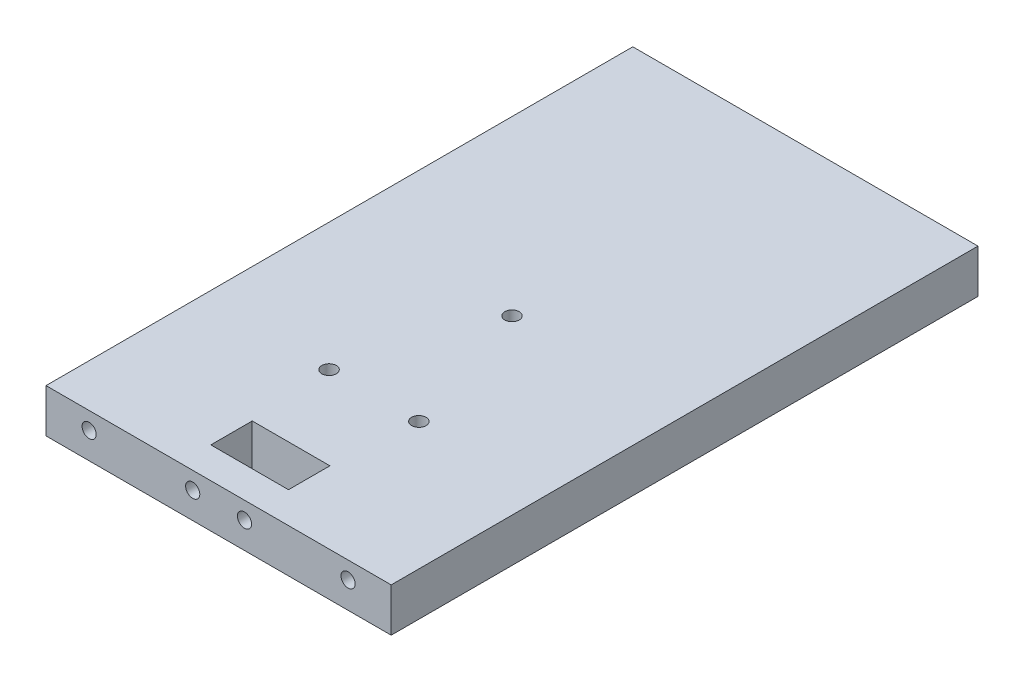
ISO-10303-21;
HEADER;
FILE_DESCRIPTION(('STEP AP214'),'2;1');
FILE_NAME('part.step','',(''),(''),'','','');
FILE_SCHEMA(('AUTOMOTIVE_DESIGN { 1 0 10303 214 1 1 1 1 }'));
ENDSEC;
DATA;
#1=APPLICATION_CONTEXT('core data for automotive mechanical design processes');
#2=APPLICATION_PROTOCOL_DEFINITION('international standard','automotive_design',2000,#1);
#3=PRODUCT_CONTEXT('',#1,'mechanical');
#4=PRODUCT('Part','Part','',(#3));
#5=PRODUCT_RELATED_PRODUCT_CATEGORY('part','',(#4));
#6=PRODUCT_DEFINITION_FORMATION('','',#4);
#7=PRODUCT_DEFINITION_CONTEXT('part definition',#1,'design');
#8=PRODUCT_DEFINITION('design','',#6,#7);
#9=PRODUCT_DEFINITION_SHAPE('','',#8);
#10=(LENGTH_UNIT() NAMED_UNIT(*) SI_UNIT(.MILLI.,.METRE.));
#11=(NAMED_UNIT(*) PLANE_ANGLE_UNIT() SI_UNIT($,.RADIAN.));
#12=(NAMED_UNIT(*) SI_UNIT($,.STERADIAN.) SOLID_ANGLE_UNIT());
#13=UNCERTAINTY_MEASURE_WITH_UNIT(LENGTH_MEASURE(1.E-05),#10,'distance_accuracy_value','');
#14=(GEOMETRIC_REPRESENTATION_CONTEXT(3) GLOBAL_UNCERTAINTY_ASSIGNED_CONTEXT((#13)) GLOBAL_UNIT_ASSIGNED_CONTEXT((#10,
#11,#12)) REPRESENTATION_CONTEXT('',''));
#15=CARTESIAN_POINT('',(0.,0.,0.));
#16=DIRECTION('',(0.,0.,1.));
#17=DIRECTION('',(1.,0.,0.));
#18=AXIS2_PLACEMENT_3D('',#15,#16,#17);
#19=CARTESIAN_POINT('',(37.5,0.,170.));
#20=DIRECTION('',(0.,0.,-1.));
#21=DIRECTION('',(-1.,0.,0.));
#22=AXIS2_PLACEMENT_3D('',#19,#20,#21);
#23=CYLINDRICAL_SURFACE('',#22,2.05);
#24=CARTESIAN_POINT('',(37.5,0.,0.));
#25=DIRECTION('',(0.,0.,1.));
#26=DIRECTION('',(1.,0.,0.));
#27=AXIS2_PLACEMENT_3D('',#24,#25,#26);
#28=CIRCLE('',#27,2.05);
#29=CARTESIAN_POINT('',(39.55,0.,0.));
#30=VERTEX_POINT('',#29);
#31=EDGE_CURVE('E163',#30,#30,#28,.T.);
#32=ORIENTED_EDGE('',*,*,#31,.F.);
#33=EDGE_LOOP('',(#32));
#34=FACE_BOUND('',#33,.T.);
#35=CARTESIAN_POINT('',(37.5,0.,10.));
#36=DIRECTION('',(0.,0.,1.));
#37=DIRECTION('',(1.,0.,0.));
#38=AXIS2_PLACEMENT_3D('',#35,#36,#37);
#39=CIRCLE('',#38,2.05);
#40=CARTESIAN_POINT('',(39.55,0.,10.));
#41=VERTEX_POINT('',#40);
#42=EDGE_CURVE('E150',#41,#41,#39,.T.);
#43=ORIENTED_EDGE('',*,*,#42,.T.);
#44=EDGE_LOOP('',(#43));
#45=FACE_BOUND('',#44,.T.);
#46=ADVANCED_FACE('F43',(#34,#45),#23,.F.);
#47=CARTESIAN_POINT('',(7.5,0.,170.));
#48=DIRECTION('',(0.,0.,-1.));
#49=DIRECTION('',(-1.,0.,0.));
#50=AXIS2_PLACEMENT_3D('',#47,#48,#49);
#51=CYLINDRICAL_SURFACE('',#50,2.05);
#52=CARTESIAN_POINT('',(7.5,0.,0.));
#53=DIRECTION('',(0.,0.,1.));
#54=DIRECTION('',(1.,0.,0.));
#55=AXIS2_PLACEMENT_3D('',#52,#53,#54);
#56=CIRCLE('',#55,2.05);
#57=CARTESIAN_POINT('',(9.55,0.,0.));
#58=VERTEX_POINT('',#57);
#59=EDGE_CURVE('E168',#58,#58,#56,.T.);
#60=ORIENTED_EDGE('',*,*,#59,.F.);
#61=EDGE_LOOP('',(#60));
#62=FACE_BOUND('',#61,.T.);
#63=CARTESIAN_POINT('',(7.5,0.,10.));
#64=DIRECTION('',(0.,0.,1.));
#65=DIRECTION('',(1.,0.,0.));
#66=AXIS2_PLACEMENT_3D('',#63,#64,#65);
#67=CIRCLE('',#66,2.05);
#68=CARTESIAN_POINT('',(9.55,0.,10.));
#69=VERTEX_POINT('',#68);
#70=EDGE_CURVE('E153',#69,#69,#67,.T.);
#71=ORIENTED_EDGE('',*,*,#70,.T.);
#72=EDGE_LOOP('',(#71));
#73=FACE_BOUND('',#72,.T.);
#74=ADVANCED_FACE('F296',(#62,#73),#51,.F.);
#75=CARTESIAN_POINT('',(-7.5,0.,170.));
#76=DIRECTION('',(0.,0.,-1.));
#77=DIRECTION('',(-1.,0.,0.));
#78=AXIS2_PLACEMENT_3D('',#75,#76,#77);
#79=CYLINDRICAL_SURFACE('',#78,2.05);
#80=CARTESIAN_POINT('',(-7.5,0.,0.));
#81=DIRECTION('',(0.,0.,1.));
#82=DIRECTION('',(1.,0.,0.));
#83=AXIS2_PLACEMENT_3D('',#80,#81,#82);
#84=CIRCLE('',#83,2.05);
#85=CARTESIAN_POINT('',(-5.45,0.,0.));
#86=VERTEX_POINT('',#85);
#87=EDGE_CURVE('E174',#86,#86,#84,.T.);
#88=ORIENTED_EDGE('',*,*,#87,.F.);
#89=EDGE_LOOP('',(#88));
#90=FACE_BOUND('',#89,.T.);
#91=CARTESIAN_POINT('',(-7.5,0.,10.));
#92=DIRECTION('',(0.,0.,1.));
#93=DIRECTION('',(1.,0.,0.));
#94=AXIS2_PLACEMENT_3D('',#91,#92,#93);
#95=CIRCLE('',#94,2.05);
#96=CARTESIAN_POINT('',(-5.45,0.,10.));
#97=VERTEX_POINT('',#96);
#98=EDGE_CURVE('E157',#97,#97,#95,.T.);
#99=ORIENTED_EDGE('',*,*,#98,.T.);
#100=EDGE_LOOP('',(#99));
#101=FACE_BOUND('',#100,.T.);
#102=ADVANCED_FACE('F304',(#90,#101),#79,.F.);
#103=CARTESIAN_POINT('',(-37.5,0.,170.));
#104=DIRECTION('',(0.,0.,-1.));
#105=DIRECTION('',(-1.,0.,0.));
#106=AXIS2_PLACEMENT_3D('',#103,#104,#105);
#107=CYLINDRICAL_SURFACE('',#106,2.04999999999999);
#108=CARTESIAN_POINT('',(-37.5,0.,0.));
#109=DIRECTION('',(0.,0.,1.));
#110=DIRECTION('',(1.,0.,0.));
#111=AXIS2_PLACEMENT_3D('',#108,#109,#110);
#112=CIRCLE('',#111,2.04999999999999);
#113=CARTESIAN_POINT('',(-35.45,0.,0.));
#114=VERTEX_POINT('',#113);
#115=EDGE_CURVE('E180',#114,#114,#112,.T.);
#116=ORIENTED_EDGE('',*,*,#115,.F.);
#117=EDGE_LOOP('',(#116));
#118=FACE_BOUND('',#117,.T.);
#119=CARTESIAN_POINT('',(-37.5,0.,10.));
#120=DIRECTION('',(0.,0.,1.));
#121=DIRECTION('',(1.,0.,0.));
#122=AXIS2_PLACEMENT_3D('',#119,#120,#121);
#123=CIRCLE('',#122,2.04999999999999);
#124=CARTESIAN_POINT('',(-35.45,0.,10.));
#125=VERTEX_POINT('',#124);
#126=EDGE_CURVE('E160',#125,#125,#123,.T.);
#127=ORIENTED_EDGE('',*,*,#126,.T.);
#128=EDGE_LOOP('',(#127));
#129=FACE_BOUND('',#128,.T.);
#130=ADVANCED_FACE('F290',(#118,#129),#107,.F.);
#131=CARTESIAN_POINT('',(0.,0.,170.));
#132=DIRECTION('',(0.,0.,1.));
#133=DIRECTION('',(1.,0.,0.));
#134=AXIS2_PLACEMENT_3D('',#131,#132,#133);
#135=PLANE('',#134);
#136=CARTESIAN_POINT('',(7.5,0.,170.));
#137=DIRECTION('',(0.,0.,1.));
#138=DIRECTION('',(1.,0.,0.));
#139=AXIS2_PLACEMENT_3D('',#136,#137,#138);
#140=CIRCLE('',#139,2.05);
#141=CARTESIAN_POINT('',(9.55,0.,170.));
#142=VERTEX_POINT('',#141);
#143=EDGE_CURVE('E171',#142,#142,#140,.T.);
#144=ORIENTED_EDGE('',*,*,#143,.F.);
#145=EDGE_LOOP('',(#144));
#146=FACE_BOUND('',#145,.T.);
#147=CARTESIAN_POINT('',(-37.5,0.,170.));
#148=DIRECTION('',(0.,0.,1.));
#149=DIRECTION('',(1.,0.,0.));
#150=AXIS2_PLACEMENT_3D('',#147,#148,#149);
#151=CIRCLE('',#150,2.04999999999999);
#152=CARTESIAN_POINT('',(-35.45,0.,170.));
#153=VERTEX_POINT('',#152);
#154=EDGE_CURVE('E183',#153,#153,#151,.T.);
#155=ORIENTED_EDGE('',*,*,#154,.F.);
#156=EDGE_LOOP('',(#155));
#157=FACE_BOUND('',#156,.T.);
#158=DIRECTION('',(0.,1.,0.));
#159=VECTOR('',#158,1.);
#160=CARTESIAN_POINT('',(50.,-5.,170.));
#161=LINE('',#160,#159);
#162=CARTESIAN_POINT('',(50.,-7.63,170.));
#163=VERTEX_POINT('',#162);
#164=CARTESIAN_POINT('',(50.,5.,170.));
#165=VERTEX_POINT('',#164);
#166=EDGE_CURVE('E189',#163,#165,#161,.T.);
#167=ORIENTED_EDGE('',*,*,#166,.T.);
#168=DIRECTION('',(-1.,0.,0.));
#169=VECTOR('',#168,1.);
#170=CARTESIAN_POINT('',(-50.,5.,170.));
#171=LINE('',#170,#169);
#172=CARTESIAN_POINT('',(-50.,5.,170.));
#173=VERTEX_POINT('',#172);
#174=EDGE_CURVE('E192',#165,#173,#171,.T.);
#175=ORIENTED_EDGE('',*,*,#174,.T.);
#176=DIRECTION('',(0.,-1.,0.));
#177=VECTOR('',#176,1.);
#178=CARTESIAN_POINT('',(-50.,5.,170.));
#179=LINE('',#178,#177);
#180=CARTESIAN_POINT('',(-50.,-7.63,170.));
#181=VERTEX_POINT('',#180);
#182=EDGE_CURVE('E196',#173,#181,#179,.T.);
#183=ORIENTED_EDGE('',*,*,#182,.T.);
#184=DIRECTION('',(1.,0.,0.));
#185=VECTOR('',#184,1.);
#186=CARTESIAN_POINT('',(-50.,-7.63,170.));
#187=LINE('',#186,#185);
#188=EDGE_CURVE('E198',#181,#163,#187,.T.);
#189=ORIENTED_EDGE('',*,*,#188,.T.);
#190=EDGE_LOOP('',(#167,#175,#183,#189));
#191=FACE_BOUND('',#190,.T.);
#192=CARTESIAN_POINT('',(-7.5,0.,170.));
#193=DIRECTION('',(0.,0.,1.));
#194=DIRECTION('',(1.,0.,0.));
#195=AXIS2_PLACEMENT_3D('',#192,#193,#194);
#196=CIRCLE('',#195,2.05);
#197=CARTESIAN_POINT('',(-5.45,0.,170.));
#198=VERTEX_POINT('',#197);
#199=EDGE_CURVE('E177',#198,#198,#196,.T.);
#200=ORIENTED_EDGE('',*,*,#199,.F.);
#201=EDGE_LOOP('',(#200));
#202=FACE_BOUND('',#201,.T.);
#203=CARTESIAN_POINT('',(37.5,0.,170.));
#204=DIRECTION('',(0.,0.,1.));
#205=DIRECTION('',(1.,0.,0.));
#206=AXIS2_PLACEMENT_3D('',#203,#204,#205);
#207=CIRCLE('',#206,2.05);
#208=CARTESIAN_POINT('',(39.55,0.,170.));
#209=VERTEX_POINT('',#208);
#210=EDGE_CURVE('E164',#209,#209,#207,.T.);
#211=ORIENTED_EDGE('',*,*,#210,.F.);
#212=EDGE_LOOP('',(#211));
#213=FACE_BOUND('',#212,.T.);
#214=ADVANCED_FACE('F272',(#146,#157,#191,#202,#213),#135,.T.);
#215=CARTESIAN_POINT('',(0.,0.,0.));
#216=DIRECTION('',(0.,0.,1.));
#217=DIRECTION('',(1.,0.,0.));
#218=AXIS2_PLACEMENT_3D('',#215,#216,#217);
#219=PLANE('',#218);
#220=DIRECTION('',(0.,1.,0.));
#221=VECTOR('',#220,1.);
#222=CARTESIAN_POINT('',(50.,5.,0.));
#223=LINE('',#222,#221);
#224=CARTESIAN_POINT('',(50.,-7.63,0.));
#225=VERTEX_POINT('',#224);
#226=CARTESIAN_POINT('',(50.,5.,0.));
#227=VERTEX_POINT('',#226);
#228=EDGE_CURVE('E186',#225,#227,#223,.T.);
#229=ORIENTED_EDGE('',*,*,#228,.F.);
#230=DIRECTION('',(1.,0.,0.));
#231=VECTOR('',#230,1.);
#232=CARTESIAN_POINT('',(-50.,-7.63,0.));
#233=LINE('',#232,#231);
#234=CARTESIAN_POINT('',(-50.,-7.63,0.));
#235=VERTEX_POINT('',#234);
#236=EDGE_CURVE('E193',#235,#225,#233,.T.);
#237=ORIENTED_EDGE('',*,*,#236,.F.);
#238=DIRECTION('',(0.,-1.,0.));
#239=VECTOR('',#238,1.);
#240=CARTESIAN_POINT('',(-50.,-5.,0.));
#241=LINE('',#240,#239);
#242=CARTESIAN_POINT('',(-50.,5.,0.));
#243=VERTEX_POINT('',#242);
#244=EDGE_CURVE('E206',#243,#235,#241,.T.);
#245=ORIENTED_EDGE('',*,*,#244,.F.);
#246=DIRECTION('',(-1.,0.,0.));
#247=VECTOR('',#246,1.);
#248=CARTESIAN_POINT('',(-50.,5.,0.));
#249=LINE('',#248,#247);
#250=EDGE_CURVE('E203',#227,#243,#249,.T.);
#251=ORIENTED_EDGE('',*,*,#250,.F.);
#252=EDGE_LOOP('',(#229,#237,#245,#251));
#253=FACE_BOUND('',#252,.T.);
#254=ORIENTED_EDGE('',*,*,#115,.T.);
#255=EDGE_LOOP('',(#254));
#256=FACE_BOUND('',#255,.T.);
#257=ORIENTED_EDGE('',*,*,#87,.T.);
#258=EDGE_LOOP('',(#257));
#259=FACE_BOUND('',#258,.T.);
#260=ORIENTED_EDGE('',*,*,#59,.T.);
#261=EDGE_LOOP('',(#260));
#262=FACE_BOUND('',#261,.T.);
#263=ORIENTED_EDGE('',*,*,#31,.T.);
#264=EDGE_LOOP('',(#263));
#265=FACE_BOUND('',#264,.T.);
#266=ADVANCED_FACE('F278',(#253,#256,#259,#262,#265),#219,.F.);
#267=CARTESIAN_POINT('',(50.,5.,170.));
#268=DIRECTION('',(-1.,0.,0.));
#269=DIRECTION('',(0.,0.,1.));
#270=AXIS2_PLACEMENT_3D('',#267,#268,#269);
#271=PLANE('',#270);
#272=ORIENTED_EDGE('',*,*,#228,.T.);
#273=DIRECTION('',(0.,0.,-1.));
#274=VECTOR('',#273,1.);
#275=CARTESIAN_POINT('',(50.,5.,170.));
#276=LINE('',#275,#274);
#277=EDGE_CURVE('E219',#165,#227,#276,.T.);
#278=ORIENTED_EDGE('',*,*,#277,.F.);
#279=ORIENTED_EDGE('',*,*,#166,.F.);
#280=DIRECTION('',(0.,0.,-1.));
#281=VECTOR('',#280,1.);
#282=CARTESIAN_POINT('',(50.,-7.63,170.));
#283=LINE('',#282,#281);
#284=EDGE_CURVE('E201',#163,#225,#283,.T.);
#285=ORIENTED_EDGE('',*,*,#284,.T.);
#286=EDGE_LOOP('',(#272,#278,#279,#285));
#287=FACE_BOUND('',#286,.T.);
#288=ADVANCED_FACE('F45',(#287),#271,.F.);
#289=CARTESIAN_POINT('',(-50.,5.,170.));
#290=DIRECTION('',(0.,-1.,0.));
#291=DIRECTION('',(0.,0.,-1.));
#292=AXIS2_PLACEMENT_3D('',#289,#290,#291);
#293=PLANE('',#292);
#294=CARTESIAN_POINT('',(0.,5.,85.));
#295=DIRECTION('',(0.,1.,0.));
#296=DIRECTION('',(0.,0.,1.));
#297=AXIS2_PLACEMENT_3D('',#294,#295,#296);
#298=CIRCLE('',#297,2.1);
#299=CARTESIAN_POINT('',(0.,5.,87.1));
#300=VERTEX_POINT('',#299);
#301=EDGE_CURVE('E232',#300,#300,#298,.T.);
#302=ORIENTED_EDGE('',*,*,#301,.F.);
#303=EDGE_LOOP('',(#302));
#304=FACE_BOUND('',#303,.T.);
#305=CARTESIAN_POINT('',(13.,5.,125.));
#306=DIRECTION('',(0.,1.,0.));
#307=DIRECTION('',(0.,0.,1.));
#308=AXIS2_PLACEMENT_3D('',#305,#306,#307);
#309=CIRCLE('',#308,2.1);
#310=CARTESIAN_POINT('',(13.,5.,127.1));
#311=VERTEX_POINT('',#310);
#312=EDGE_CURVE('E243',#311,#311,#309,.T.);
#313=ORIENTED_EDGE('',*,*,#312,.F.);
#314=EDGE_LOOP('',(#313));
#315=FACE_BOUND('',#314,.T.);
#316=CARTESIAN_POINT('',(-13.,5.,125.));
#317=DIRECTION('',(0.,1.,0.));
#318=DIRECTION('',(0.,0.,1.));
#319=AXIS2_PLACEMENT_3D('',#316,#317,#318);
#320=CIRCLE('',#319,2.10000000000001);
#321=CARTESIAN_POINT('',(-13.,5.,127.1));
#322=VERTEX_POINT('',#321);
#323=EDGE_CURVE('E135',#322,#322,#320,.T.);
#324=ORIENTED_EDGE('',*,*,#323,.F.);
#325=EDGE_LOOP('',(#324));
#326=FACE_BOUND('',#325,.T.);
#327=DIRECTION('',(-1.,0.,0.));
#328=VECTOR('',#327,1.);
#329=CARTESIAN_POINT('',(-11.25,5.,149.));
#330=LINE('',#329,#328);
#331=CARTESIAN_POINT('',(11.25,5.,149.));
#332=VERTEX_POINT('',#331);
#333=CARTESIAN_POINT('',(-11.25,5.,149.));
#334=VERTEX_POINT('',#333);
#335=EDGE_CURVE('E141',#332,#334,#330,.T.);
#336=ORIENTED_EDGE('',*,*,#335,.F.);
#337=DIRECTION('',(0.,0.,-1.));
#338=VECTOR('',#337,1.);
#339=CARTESIAN_POINT('',(11.25,5.,149.));
#340=LINE('',#339,#338);
#341=CARTESIAN_POINT('',(11.25,5.,161.));
#342=VERTEX_POINT('',#341);
#343=EDGE_CURVE('E59',#342,#332,#340,.T.);
#344=ORIENTED_EDGE('',*,*,#343,.F.);
#345=DIRECTION('',(1.,0.,0.));
#346=VECTOR('',#345,1.);
#347=CARTESIAN_POINT('',(-11.25,5.,161.));
#348=LINE('',#347,#346);
#349=CARTESIAN_POINT('',(-11.25,5.,161.));
#350=VERTEX_POINT('',#349);
#351=EDGE_CURVE('E129',#350,#342,#348,.T.);
#352=ORIENTED_EDGE('',*,*,#351,.F.);
#353=DIRECTION('',(0.,0.,1.));
#354=VECTOR('',#353,1.);
#355=CARTESIAN_POINT('',(-11.25,5.,149.));
#356=LINE('',#355,#354);
#357=EDGE_CURVE('E132',#334,#350,#356,.T.);
#358=ORIENTED_EDGE('',*,*,#357,.F.);
#359=EDGE_LOOP('',(#336,#344,#352,#358));
#360=FACE_BOUND('',#359,.T.);
#361=ORIENTED_EDGE('',*,*,#250,.T.);
#362=DIRECTION('',(0.,0.,-1.));
#363=VECTOR('',#362,1.);
#364=CARTESIAN_POINT('',(-50.,5.,170.));
#365=LINE('',#364,#363);
#366=EDGE_CURVE('E216',#173,#243,#365,.T.);
#367=ORIENTED_EDGE('',*,*,#366,.F.);
#368=ORIENTED_EDGE('',*,*,#174,.F.);
#369=ORIENTED_EDGE('',*,*,#277,.T.);
#370=EDGE_LOOP('',(#361,#367,#368,#369));
#371=FACE_BOUND('',#370,.T.);
#372=ADVANCED_FACE('F255',(#304,#315,#326,#360,#371),#293,.F.);
#373=CARTESIAN_POINT('',(-50.,-5.,170.));
#374=DIRECTION('',(1.,0.,0.));
#375=DIRECTION('',(0.,0.,-1.));
#376=AXIS2_PLACEMENT_3D('',#373,#374,#375);
#377=PLANE('',#376);
#378=ORIENTED_EDGE('',*,*,#244,.T.);
#379=DIRECTION('',(0.,0.,-1.));
#380=VECTOR('',#379,1.);
#381=CARTESIAN_POINT('',(-50.,-7.63,170.));
#382=LINE('',#381,#380);
#383=EDGE_CURVE('E213',#181,#235,#382,.T.);
#384=ORIENTED_EDGE('',*,*,#383,.F.);
#385=ORIENTED_EDGE('',*,*,#182,.F.);
#386=ORIENTED_EDGE('',*,*,#366,.T.);
#387=EDGE_LOOP('',(#378,#384,#385,#386));
#388=FACE_BOUND('',#387,.T.);
#389=ADVANCED_FACE('F258',(#388),#377,.F.);
#390=CARTESIAN_POINT('',(-50.,-7.63,170.));
#391=DIRECTION('',(0.,1.,0.));
#392=DIRECTION('',(0.,0.,1.));
#393=AXIS2_PLACEMENT_3D('',#390,#391,#392);
#394=PLANE('',#393);
#395=CARTESIAN_POINT('',(0.,-7.63,85.));
#396=DIRECTION('',(0.,1.,0.));
#397=DIRECTION('',(0.,0.,1.));
#398=AXIS2_PLACEMENT_3D('',#395,#396,#397);
#399=CIRCLE('',#398,2.1);
#400=CARTESIAN_POINT('',(0.,-7.63,87.1));
#401=VERTEX_POINT('',#400);
#402=EDGE_CURVE('E228',#401,#401,#399,.T.);
#403=ORIENTED_EDGE('',*,*,#402,.T.);
#404=EDGE_LOOP('',(#403));
#405=FACE_BOUND('',#404,.T.);
#406=CARTESIAN_POINT('',(13.,-7.63,125.));
#407=DIRECTION('',(0.,1.,0.));
#408=DIRECTION('',(0.,0.,1.));
#409=AXIS2_PLACEMENT_3D('',#406,#407,#408);
#410=CIRCLE('',#409,2.1);
#411=CARTESIAN_POINT('',(13.,-7.63,127.1));
#412=VERTEX_POINT('',#411);
#413=EDGE_CURVE('E237',#412,#412,#410,.T.);
#414=ORIENTED_EDGE('',*,*,#413,.T.);
#415=EDGE_LOOP('',(#414));
#416=FACE_BOUND('',#415,.T.);
#417=CARTESIAN_POINT('',(-13.,-7.63,125.));
#418=DIRECTION('',(0.,1.,0.));
#419=DIRECTION('',(0.,0.,1.));
#420=AXIS2_PLACEMENT_3D('',#417,#418,#419);
#421=CIRCLE('',#420,2.10000000000001);
#422=CARTESIAN_POINT('',(-13.,-7.63,127.1));
#423=VERTEX_POINT('',#422);
#424=EDGE_CURVE('E246',#423,#423,#421,.T.);
#425=ORIENTED_EDGE('',*,*,#424,.T.);
#426=EDGE_LOOP('',(#425));
#427=FACE_BOUND('',#426,.T.);
#428=DIRECTION('',(1.,0.,0.));
#429=VECTOR('',#428,1.);
#430=CARTESIAN_POINT('',(-11.25,-7.63,161.));
#431=LINE('',#430,#429);
#432=CARTESIAN_POINT('',(-11.25,-7.63,161.));
#433=VERTEX_POINT('',#432);
#434=CARTESIAN_POINT('',(11.25,-7.63,161.));
#435=VERTEX_POINT('',#434);
#436=EDGE_CURVE('E119',#433,#435,#431,.T.);
#437=ORIENTED_EDGE('',*,*,#436,.T.);
#438=DIRECTION('',(0.,0.,-1.));
#439=VECTOR('',#438,1.);
#440=CARTESIAN_POINT('',(11.25,-7.63,149.));
#441=LINE('',#440,#439);
#442=CARTESIAN_POINT('',(11.25,-7.63,149.));
#443=VERTEX_POINT('',#442);
#444=EDGE_CURVE('E113',#435,#443,#441,.T.);
#445=ORIENTED_EDGE('',*,*,#444,.T.);
#446=DIRECTION('',(-1.,0.,0.));
#447=VECTOR('',#446,1.);
#448=CARTESIAN_POINT('',(-11.25,-7.63,149.));
#449=LINE('',#448,#447);
#450=CARTESIAN_POINT('',(-11.25,-7.63,149.));
#451=VERTEX_POINT('',#450);
#452=EDGE_CURVE('E122',#443,#451,#449,.T.);
#453=ORIENTED_EDGE('',*,*,#452,.T.);
#454=DIRECTION('',(0.,0.,1.));
#455=VECTOR('',#454,1.);
#456=CARTESIAN_POINT('',(-11.25,-7.63,149.));
#457=LINE('',#456,#455);
#458=EDGE_CURVE('E67',#451,#433,#457,.T.);
#459=ORIENTED_EDGE('',*,*,#458,.T.);
#460=EDGE_LOOP('',(#437,#445,#453,#459));
#461=FACE_BOUND('',#460,.T.);
#462=ORIENTED_EDGE('',*,*,#236,.T.);
#463=ORIENTED_EDGE('',*,*,#284,.F.);
#464=ORIENTED_EDGE('',*,*,#188,.F.);
#465=ORIENTED_EDGE('',*,*,#383,.T.);
#466=EDGE_LOOP('',(#462,#463,#464,#465));
#467=FACE_BOUND('',#466,.T.);
#468=ADVANCED_FACE('F126',(#405,#416,#427,#461,#467),#394,.F.);
#469=CARTESIAN_POINT('',(-37.5,0.,161.));
#470=DIRECTION('',(0.,0.,1.));
#471=DIRECTION('',(1.,0.,0.));
#472=AXIS2_PLACEMENT_3D('',#469,#470,#471);
#473=CIRCLE('',#472,2.04999999999999);
#474=CARTESIAN_POINT('',(-35.45,0.,161.));
#475=VERTEX_POINT('',#474);
#476=EDGE_CURVE('E52',#475,#475,#473,.T.);
#477=ORIENTED_EDGE('',*,*,#476,.F.);
#478=EDGE_LOOP('',(#477));
#479=FACE_BOUND('',#478,.T.);
#480=ORIENTED_EDGE('',*,*,#154,.T.);
#481=EDGE_LOOP('',(#480));
#482=FACE_BOUND('',#481,.T.);
#483=ADVANCED_FACE('F281',(#479,#482),#107,.F.);
#484=CARTESIAN_POINT('',(-7.5,0.,161.));
#485=DIRECTION('',(0.,0.,1.));
#486=DIRECTION('',(1.,0.,0.));
#487=AXIS2_PLACEMENT_3D('',#484,#485,#486);
#488=CIRCLE('',#487,2.05);
#489=CARTESIAN_POINT('',(-5.45,0.,161.));
#490=VERTEX_POINT('',#489);
#491=EDGE_CURVE('E154',#490,#490,#488,.T.);
#492=ORIENTED_EDGE('',*,*,#491,.F.);
#493=EDGE_LOOP('',(#492));
#494=FACE_BOUND('',#493,.T.);
#495=ORIENTED_EDGE('',*,*,#199,.T.);
#496=EDGE_LOOP('',(#495));
#497=FACE_BOUND('',#496,.T.);
#498=ADVANCED_FACE('F287',(#494,#497),#79,.F.);
#499=CARTESIAN_POINT('',(7.5,0.,161.));
#500=DIRECTION('',(0.,0.,1.));
#501=DIRECTION('',(1.,0.,0.));
#502=AXIS2_PLACEMENT_3D('',#499,#500,#501);
#503=CIRCLE('',#502,2.05);
#504=CARTESIAN_POINT('',(9.55,0.,161.));
#505=VERTEX_POINT('',#504);
#506=EDGE_CURVE('E226',#505,#505,#503,.T.);
#507=ORIENTED_EDGE('',*,*,#506,.F.);
#508=EDGE_LOOP('',(#507));
#509=FACE_BOUND('',#508,.T.);
#510=ORIENTED_EDGE('',*,*,#143,.T.);
#511=EDGE_LOOP('',(#510));
#512=FACE_BOUND('',#511,.T.);
#513=ADVANCED_FACE('F307',(#509,#512),#51,.F.);
#514=CARTESIAN_POINT('',(37.5,0.,161.));
#515=DIRECTION('',(0.,0.,1.));
#516=DIRECTION('',(1.,0.,0.));
#517=AXIS2_PLACEMENT_3D('',#514,#515,#516);
#518=CIRCLE('',#517,2.05);
#519=CARTESIAN_POINT('',(39.55,0.,161.));
#520=VERTEX_POINT('',#519);
#521=EDGE_CURVE('E12',#520,#520,#518,.T.);
#522=ORIENTED_EDGE('',*,*,#521,.F.);
#523=EDGE_LOOP('',(#522));
#524=FACE_BOUND('',#523,.T.);
#525=ORIENTED_EDGE('',*,*,#210,.T.);
#526=EDGE_LOOP('',(#525));
#527=FACE_BOUND('',#526,.T.);
#528=ADVANCED_FACE('F299',(#524,#527),#23,.F.);
#529=CARTESIAN_POINT('',(0.,0.,161.));
#530=DIRECTION('',(0.,0.,1.));
#531=DIRECTION('',(1.,0.,0.));
#532=AXIS2_PLACEMENT_3D('',#529,#530,#531);
#533=PLANE('',#532);
#534=ORIENTED_EDGE('',*,*,#476,.T.);
#535=EDGE_LOOP('',(#534));
#536=FACE_BOUND('',#535,.T.);
#537=ADVANCED_FACE('F312',(#536),#533,.T.);
#538=CARTESIAN_POINT('',(0.,0.,10.));
#539=DIRECTION('',(0.,0.,1.));
#540=DIRECTION('',(1.,0.,0.));
#541=AXIS2_PLACEMENT_3D('',#538,#539,#540);
#542=PLANE('',#541);
#543=ORIENTED_EDGE('',*,*,#126,.F.);
#544=EDGE_LOOP('',(#543));
#545=FACE_BOUND('',#544,.T.);
#546=ADVANCED_FACE('F317',(#545),#542,.F.);
#547=CARTESIAN_POINT('',(0.,0.,10.));
#548=DIRECTION('',(0.,0.,1.));
#549=DIRECTION('',(1.,0.,0.));
#550=AXIS2_PLACEMENT_3D('',#547,#548,#549);
#551=PLANE('',#550);
#552=ORIENTED_EDGE('',*,*,#98,.F.);
#553=EDGE_LOOP('',(#552));
#554=FACE_BOUND('',#553,.T.);
#555=ADVANCED_FACE('F348',(#554),#551,.F.);
#556=CARTESIAN_POINT('',(0.,0.,10.));
#557=DIRECTION('',(0.,0.,1.));
#558=DIRECTION('',(1.,0.,0.));
#559=AXIS2_PLACEMENT_3D('',#556,#557,#558);
#560=PLANE('',#559);
#561=ORIENTED_EDGE('',*,*,#70,.F.);
#562=EDGE_LOOP('',(#561));
#563=FACE_BOUND('',#562,.T.);
#564=ADVANCED_FACE('F350',(#563),#560,.F.);
#565=CARTESIAN_POINT('',(0.,0.,161.));
#566=DIRECTION('',(0.,0.,1.));
#567=DIRECTION('',(1.,0.,0.));
#568=AXIS2_PLACEMENT_3D('',#565,#566,#567);
#569=PLANE('',#568);
#570=ORIENTED_EDGE('',*,*,#521,.T.);
#571=EDGE_LOOP('',(#570));
#572=FACE_BOUND('',#571,.T.);
#573=ADVANCED_FACE('F356',(#572),#569,.T.);
#574=CARTESIAN_POINT('',(0.,0.,10.));
#575=DIRECTION('',(0.,0.,1.));
#576=DIRECTION('',(1.,0.,0.));
#577=AXIS2_PLACEMENT_3D('',#574,#575,#576);
#578=PLANE('',#577);
#579=ORIENTED_EDGE('',*,*,#42,.F.);
#580=EDGE_LOOP('',(#579));
#581=FACE_BOUND('',#580,.T.);
#582=ADVANCED_FACE('F364',(#581),#578,.F.);
#583=CARTESIAN_POINT('',(11.25,-7.63,149.));
#584=DIRECTION('',(1.,0.,0.));
#585=DIRECTION('',(0.,0.,-1.));
#586=AXIS2_PLACEMENT_3D('',#583,#584,#585);
#587=PLANE('',#586);
#588=ORIENTED_EDGE('',*,*,#343,.T.);
#589=DIRECTION('',(0.,1.,0.));
#590=VECTOR('',#589,1.);
#591=CARTESIAN_POINT('',(11.25,-7.63,149.));
#592=LINE('',#591,#590);
#593=EDGE_CURVE('E109',#443,#332,#592,.T.);
#594=ORIENTED_EDGE('',*,*,#593,.F.);
#595=ORIENTED_EDGE('',*,*,#444,.F.);
#596=DIRECTION('',(0.,1.,0.));
#597=VECTOR('',#596,1.);
#598=CARTESIAN_POINT('',(11.25,-7.63,161.));
#599=LINE('',#598,#597);
#600=EDGE_CURVE('E145',#435,#342,#599,.T.);
#601=ORIENTED_EDGE('',*,*,#600,.T.);
#602=EDGE_LOOP('',(#588,#594,#595,#601));
#603=FACE_BOUND('',#602,.T.);
#604=ADVANCED_FACE('F111',(#603),#587,.F.);
#605=CARTESIAN_POINT('',(-11.25,-7.63,161.));
#606=DIRECTION('',(0.,0.,1.));
#607=DIRECTION('',(1.,0.,0.));
#608=AXIS2_PLACEMENT_3D('',#605,#606,#607);
#609=PLANE('',#608);
#610=ORIENTED_EDGE('',*,*,#491,.T.);
#611=EDGE_LOOP('',(#610));
#612=FACE_BOUND('',#611,.T.);
#613=ORIENTED_EDGE('',*,*,#506,.T.);
#614=EDGE_LOOP('',(#613));
#615=FACE_BOUND('',#614,.T.);
#616=ORIENTED_EDGE('',*,*,#351,.T.);
#617=ORIENTED_EDGE('',*,*,#600,.F.);
#618=ORIENTED_EDGE('',*,*,#436,.F.);
#619=DIRECTION('',(0.,1.,0.));
#620=VECTOR('',#619,1.);
#621=CARTESIAN_POINT('',(-11.25,-7.63,161.));
#622=LINE('',#621,#620);
#623=EDGE_CURVE('E147',#433,#350,#622,.T.);
#624=ORIENTED_EDGE('',*,*,#623,.T.);
#625=EDGE_LOOP('',(#616,#617,#618,#624));
#626=FACE_BOUND('',#625,.T.);
#627=ADVANCED_FACE('F371',(#612,#615,#626),#609,.F.);
#628=CARTESIAN_POINT('',(-11.25,-7.63,149.));
#629=DIRECTION('',(-1.,0.,0.));
#630=DIRECTION('',(0.,0.,1.));
#631=AXIS2_PLACEMENT_3D('',#628,#629,#630);
#632=PLANE('',#631);
#633=ORIENTED_EDGE('',*,*,#357,.T.);
#634=ORIENTED_EDGE('',*,*,#623,.F.);
#635=ORIENTED_EDGE('',*,*,#458,.F.);
#636=DIRECTION('',(0.,1.,0.));
#637=VECTOR('',#636,1.);
#638=CARTESIAN_POINT('',(-11.25,-7.63,149.));
#639=LINE('',#638,#637);
#640=EDGE_CURVE('E118',#451,#334,#639,.T.);
#641=ORIENTED_EDGE('',*,*,#640,.T.);
#642=EDGE_LOOP('',(#633,#634,#635,#641));
#643=FACE_BOUND('',#642,.T.);
#644=ADVANCED_FACE('F374',(#643),#632,.F.);
#645=CARTESIAN_POINT('',(-11.25,-7.63,149.));
#646=DIRECTION('',(0.,0.,-1.));
#647=DIRECTION('',(-1.,0.,0.));
#648=AXIS2_PLACEMENT_3D('',#645,#646,#647);
#649=PLANE('',#648);
#650=ORIENTED_EDGE('',*,*,#335,.T.);
#651=ORIENTED_EDGE('',*,*,#640,.F.);
#652=ORIENTED_EDGE('',*,*,#452,.F.);
#653=ORIENTED_EDGE('',*,*,#593,.T.);
#654=EDGE_LOOP('',(#650,#651,#652,#653));
#655=FACE_BOUND('',#654,.T.);
#656=ADVANCED_FACE('F123',(#655),#649,.F.);
#657=CARTESIAN_POINT('',(-13.,-7.63,125.));
#658=DIRECTION('',(0.,1.,0.));
#659=DIRECTION('',(0.,0.,1.));
#660=AXIS2_PLACEMENT_3D('',#657,#658,#659);
#661=CYLINDRICAL_SURFACE('',#660,2.10000000000001);
#662=ORIENTED_EDGE('',*,*,#424,.F.);
#663=EDGE_LOOP('',(#662));
#664=FACE_BOUND('',#663,.T.);
#665=ORIENTED_EDGE('',*,*,#323,.T.);
#666=EDGE_LOOP('',(#665));
#667=FACE_BOUND('',#666,.T.);
#668=ADVANCED_FACE('F253',(#664,#667),#661,.F.);
#669=CARTESIAN_POINT('',(13.,-7.63,125.));
#670=DIRECTION('',(0.,1.,0.));
#671=DIRECTION('',(0.,0.,1.));
#672=AXIS2_PLACEMENT_3D('',#669,#670,#671);
#673=CYLINDRICAL_SURFACE('',#672,2.1);
#674=ORIENTED_EDGE('',*,*,#413,.F.);
#675=EDGE_LOOP('',(#674));
#676=FACE_BOUND('',#675,.T.);
#677=ORIENTED_EDGE('',*,*,#312,.T.);
#678=EDGE_LOOP('',(#677));
#679=FACE_BOUND('',#678,.T.);
#680=ADVANCED_FACE('F382',(#676,#679),#673,.F.);
#681=CARTESIAN_POINT('',(0.,-7.63,85.));
#682=DIRECTION('',(0.,1.,0.));
#683=DIRECTION('',(0.,0.,1.));
#684=AXIS2_PLACEMENT_3D('',#681,#682,#683);
#685=CYLINDRICAL_SURFACE('',#684,2.1);
#686=ORIENTED_EDGE('',*,*,#402,.F.);
#687=EDGE_LOOP('',(#686));
#688=FACE_BOUND('',#687,.T.);
#689=ORIENTED_EDGE('',*,*,#301,.T.);
#690=EDGE_LOOP('',(#689));
#691=FACE_BOUND('',#690,.T.);
#692=ADVANCED_FACE('F386',(#688,#691),#685,.F.);
#693=CLOSED_SHELL('',(#46,#74,#102,#130,#214,#266,#288,#372,#389,#468,#483,#498,#513,#528,#537,
#546,#555,#564,#573,#582,#604,#627,#644,#656,#668,#680,#692));
#694=MANIFOLD_SOLID_BREP('B2',#693);
#695=ADVANCED_BREP_SHAPE_REPRESENTATION('',(#18,#694),#14);
#696=SHAPE_DEFINITION_REPRESENTATION(#9,#695);
ENDSEC;
END-ISO-10303-21;
